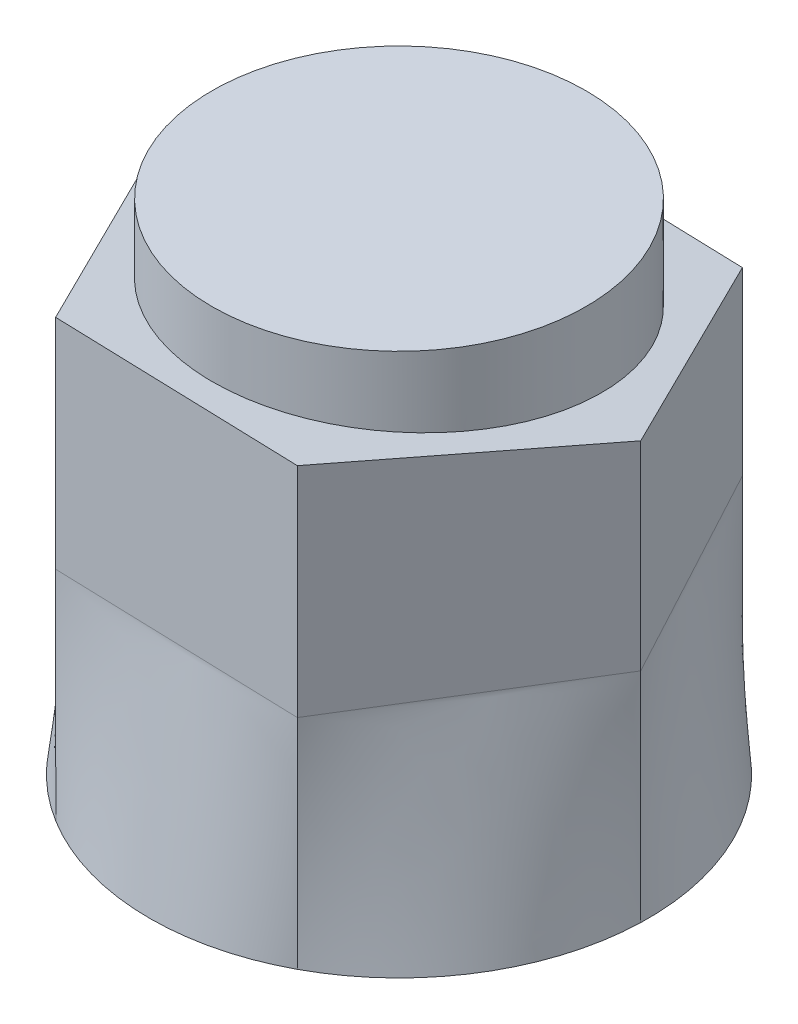
ISO-10303-21;
HEADER;
FILE_DESCRIPTION(('STEP AP214'),'2;1');
FILE_NAME('part.step','',(''),(''),'','','');
FILE_SCHEMA(('AUTOMOTIVE_DESIGN { 1 0 10303 214 1 1 1 1 }'));
ENDSEC;
DATA;
#1=APPLICATION_CONTEXT('core data for automotive mechanical design processes');
#2=APPLICATION_PROTOCOL_DEFINITION('international standard','automotive_design',2000,#1);
#3=PRODUCT_CONTEXT('',#1,'mechanical');
#4=PRODUCT('Part','Part','',(#3));
#5=PRODUCT_RELATED_PRODUCT_CATEGORY('part','',(#4));
#6=PRODUCT_DEFINITION_FORMATION('','',#4);
#7=PRODUCT_DEFINITION_CONTEXT('part definition',#1,'design');
#8=PRODUCT_DEFINITION('design','',#6,#7);
#9=PRODUCT_DEFINITION_SHAPE('','',#8);
#10=(LENGTH_UNIT() NAMED_UNIT(*) SI_UNIT(.MILLI.,.METRE.));
#11=(NAMED_UNIT(*) PLANE_ANGLE_UNIT() SI_UNIT($,.RADIAN.));
#12=(NAMED_UNIT(*) SI_UNIT($,.STERADIAN.) SOLID_ANGLE_UNIT());
#13=UNCERTAINTY_MEASURE_WITH_UNIT(LENGTH_MEASURE(1.E-05),#10,'distance_accuracy_value','');
#14=(GEOMETRIC_REPRESENTATION_CONTEXT(3) GLOBAL_UNCERTAINTY_ASSIGNED_CONTEXT((#13)) GLOBAL_UNIT_ASSIGNED_CONTEXT((#10,
#11,#12)) REPRESENTATION_CONTEXT('',''));
#15=CARTESIAN_POINT('',(0.,0.,0.));
#16=DIRECTION('',(0.,0.,1.));
#17=DIRECTION('',(1.,0.,0.));
#18=AXIS2_PLACEMENT_3D('',#15,#16,#17);
#19=CARTESIAN_POINT('',(0.,0.,0.));
#20=DIRECTION('',(0.,1.,0.));
#21=DIRECTION('',(0.,0.,1.));
#22=AXIS2_PLACEMENT_3D('',#19,#20,#21);
#23=PLANE('',#22);
#24=CARTESIAN_POINT('',(0.,0.,0.));
#25=DIRECTION('',(0.,1.,0.));
#26=DIRECTION('',(0.,0.,1.));
#27=AXIS2_PLACEMENT_3D('',#24,#25,#26);
#28=CIRCLE('',#27,12.7);
#29=CARTESIAN_POINT('',(-6.68296668589842,0.,10.7994424057528));
#30=VERTEX_POINT('',#29);
#31=CARTESIAN_POINT('',(6.01110812713965,0.,11.1873401255095));
#32=VERTEX_POINT('',#31);
#33=EDGE_CURVE('E106',#30,#32,#28,.T.);
#34=ORIENTED_EDGE('',*,*,#33,.F.);
#35=CARTESIAN_POINT('',(-12.6940748130381,0.,-0.387897719756733));
#36=VERTEX_POINT('',#35);
#37=EDGE_CURVE('E266',#36,#30,#28,.T.);
#38=ORIENTED_EDGE('',*,*,#37,.F.);
#39=CARTESIAN_POINT('',(-6.01110812713965,0.,-11.1873401255095));
#40=VERTEX_POINT('',#39);
#41=EDGE_CURVE('E416',#40,#36,#28,.T.);
#42=ORIENTED_EDGE('',*,*,#41,.F.);
#43=CARTESIAN_POINT('',(6.68296668589842,0.,-10.7994424057528));
#44=VERTEX_POINT('',#43);
#45=EDGE_CURVE('E332',#44,#40,#28,.T.);
#46=ORIENTED_EDGE('',*,*,#45,.F.);
#47=CARTESIAN_POINT('',(12.6940748130381,0.,0.387897719756726));
#48=VERTEX_POINT('',#47);
#49=EDGE_CURVE('E467',#48,#44,#28,.T.);
#50=ORIENTED_EDGE('',*,*,#49,.F.);
#51=EDGE_CURVE('E468',#32,#48,#28,.T.);
#52=ORIENTED_EDGE('',*,*,#51,.F.);
#53=EDGE_LOOP('',(#34,#38,#42,#46,#50,#52));
#54=FACE_BOUND('',#53,.T.);
#55=ADVANCED_FACE('F97',(#54),#23,.F.);
#56=CARTESIAN_POINT('',(-12.7,11.1125,-0.388078777970537));
#57=CARTESIAN_POINT('',(-12.6940748130381,0.,-0.387897719756733));
#58=CARTESIAN_POINT('',(-12.1428261599673,11.1125,-1.28845238122696));
#59=CARTESIAN_POINT('',(-12.6617500030583,0.,-1.44573728750991));
#60=CARTESIAN_POINT('',(-11.5856523199347,11.1125,-2.18882598448338));
#61=CARTESIAN_POINT('',(-12.4939905005337,0.,-2.53611988957809));
#62=CARTESIAN_POINT('',(-10.4713046398693,11.1125,-3.98957319099623));
#63=CARTESIAN_POINT('',(-11.8614424711025,0.,-4.67310231286075));
#64=CARTESIAN_POINT('',(-9.91413079983663,11.1125,-4.88994679425265));
#65=CARTESIAN_POINT('',(-11.3963409145963,0.,-5.7183993954558));
#66=CARTESIAN_POINT('',(-8.79978311977128,11.1125,-6.6906940007655));
#67=CARTESIAN_POINT('',(-10.2025438969093,0.,-7.64753397634105));
#68=CARTESIAN_POINT('',(-8.2426092797386,11.1125,-7.59106760402193));
#69=CARTESIAN_POINT('',(-9.47459076760174,0.,-8.5301718920673));
#70=CARTESIAN_POINT('',(-7.12826159967325,11.1125,-9.39181481053478));
#71=CARTESIAN_POINT('',(-7.84435928388421,0.,-10.0497626910827));
#72=CARTESIAN_POINT('',(-6.57108775964057,11.1125,-10.2921884137912));
#73=CARTESIAN_POINT('',(-6.94338647093211,0.,-10.6864144482479));
#74=CARTESIAN_POINT('',(-6.01391391960789,11.1125,-11.1925620170476));
#75=CARTESIAN_POINT('',(-6.01110812713965,0.,-11.1873401255095));
#76=B_SPLINE_SURFACE_WITH_KNOTS('',3,1,((#56,#57),(#58,#59),(#60,#61),(#62,#63),(#64,#65),(#66,
#67),(#68,#69),(#70,#71),(#72,#73),(#74,#75)),.UNSPECIFIED.,.F.,.F.,.F.,(4,2,2,2,4),(2,2),(0.,
0.25,0.5,0.75,1.),(0.,1.),.UNSPECIFIED.);
#77=DIRECTION('',(-0.52621784928334,0.,0.850349795728567));
#78=VECTOR('',#77,1.);
#79=CARTESIAN_POINT('',(-6.01391391960789,11.1125,-11.1925620170476));
#80=LINE('',#79,#78);
#81=CARTESIAN_POINT('',(-6.01391391960789,11.1125,-11.1925620170476));
#82=VERTEX_POINT('',#81);
#83=CARTESIAN_POINT('',(-12.7,11.1125,-0.388078777970539));
#84=VERTEX_POINT('',#83);
#85=EDGE_CURVE('E316',#82,#84,#80,.T.);
#86=DIRECTION('',(0.000252489724996501,-0.999999857716082,0.000469911432631494));
#87=VECTOR('',#86,1.);
#88=CARTESIAN_POINT('',(-6.01251102337377,5.55625,-11.1899510712786));
#89=LINE('',#88,#87);
#90=EDGE_CURVE('E311',#82,#40,#89,.T.);
#91=DIRECTION('',(-0.000533200100685727,0.999999857716082,-1.62932002737735E-05));
#92=VECTOR('',#91,1.);
#93=CARTESIAN_POINT('',(-12.697037406519,5.55625,-0.387988248863635));
#94=LINE('',#93,#92);
#95=EDGE_CURVE('E309',#36,#84,#94,.T.);
#96=ORIENTED_EDGE('',*,*,#85,.F.);
#97=ORIENTED_EDGE('',*,*,#90,.T.);
#98=ORIENTED_EDGE('',*,*,#41,.T.);
#99=ORIENTED_EDGE('',*,*,#95,.T.);
#100=EDGE_LOOP('',(#96,#97,#98,#99));
#101=FACE_BOUND('',#100,.T.);
#102=ADVANCED_FACE('F227',(#101),#76,.T.);
#103=CARTESIAN_POINT('',(-6.01391391960789,11.1125,-11.1925620170476));
#104=CARTESIAN_POINT('',(-6.01110812713965,0.,-11.1873401255095));
#105=CARTESIAN_POINT('',(-4.95558058627455,11.1125,-11.1602221188834));
#106=CARTESIAN_POINT('',(-5.07882978334719,0.,-11.6882658027712));
#107=CARTESIAN_POINT('',(-3.89724725294122,11.1125,-11.1278822207192));
#108=CARTESIAN_POINT('',(-4.05065099884922,0.,-12.0881731128927));
#109=CARTESIAN_POINT('',(-1.78058058627455,11.1125,-11.0632024243908));
#110=CARTESIAN_POINT('',(-1.88369591813004,0.,-12.6088616619328));
#111=CARTESIAN_POINT('',(-0.722247252941219,11.1125,-11.0308625262266));
#112=CARTESIAN_POINT('',(-0.745891311847872,0.,-12.7287204399563));
#113=CARTESIAN_POINT('',(1.39441941372545,11.1125,-10.9661827298982));
#114=CARTESIAN_POINT('',(1.52168675136133,0.,-12.6594291861198));
#115=CARTESIAN_POINT('',(2.45275274705878,11.1125,-10.933842831734));
#116=CARTESIAN_POINT('',(2.65005017337737,0.,-12.4703222412383));
#117=CARTESIAN_POINT('',(4.56941941372544,11.1125,-10.8691630354055));
#118=CARTESIAN_POINT('',(4.7811701505406,0.,-11.8182957617974));
#119=CARTESIAN_POINT('',(5.62775274705878,11.1125,-10.8368231372413));
#120=CARTESIAN_POINT('',(5.78301315208568,0.,-11.3563562962443));
#121=CARTESIAN_POINT('',(6.68608608039211,11.1125,-10.8044832390771));
#122=CARTESIAN_POINT('',(6.68296668589842,0.,-10.7994424057528));
#123=B_SPLINE_SURFACE_WITH_KNOTS('',3,1,((#103,#104),(#105,#106),(#107,#108),(#109,#110),(#111,
#112),(#113,#114),(#115,#116),(#117,#118),(#119,#120),(#121,#122)),.UNSPECIFIED.,.F.,.F.,.F.,(4,
2,2,2,4),(2,2),(0.,0.25,0.5,0.75,1.),(0.,1.),.UNSPECIFIED.);
#124=DIRECTION('',(-0.999533449845517,0.,-0.0305431275398998));
#125=VECTOR('',#124,1.);
#126=CARTESIAN_POINT('',(6.68608608039211,11.1125,-10.8044832390771));
#127=LINE('',#126,#125);
#128=CARTESIAN_POINT('',(6.68608608039211,11.1125,-10.8044832390771));
#129=VERTEX_POINT('',#128);
#130=EDGE_CURVE('E324',#129,#82,#127,.T.);
#131=DIRECTION('',(-0.000280710375689694,-0.999999857716082,0.00045361823235712));
#132=VECTOR('',#131,1.);
#133=CARTESIAN_POINT('',(6.68452638314526,5.55625,-10.801962822415));
#134=LINE('',#133,#132);
#135=EDGE_CURVE('E334',#129,#44,#134,.T.);
#136=ORIENTED_EDGE('',*,*,#130,.F.);
#137=ORIENTED_EDGE('',*,*,#135,.T.);
#138=ORIENTED_EDGE('',*,*,#45,.T.);
#139=ORIENTED_EDGE('',*,*,#90,.F.);
#140=EDGE_LOOP('',(#136,#137,#138,#139));
#141=FACE_BOUND('',#140,.T.);
#142=ADVANCED_FACE('F233',(#141),#123,.T.);
#143=CARTESIAN_POINT('',(-6.68608608039211,11.1125,10.8044832390771));
#144=CARTESIAN_POINT('',(-6.68296668589842,0.,10.7994424057528));
#145=CARTESIAN_POINT('',(-7.18724557369277,11.1125,9.87176973765646));
#146=CARTESIAN_POINT('',(-7.58292021971115,0.,10.2425285152613));
#147=CARTESIAN_POINT('',(-7.68840506699342,11.1125,8.93905623623583));
#148=CARTESIAN_POINT('',(-8.44333950168444,0.,9.55205322331457));
#149=CARTESIAN_POINT('',(-8.69072405359474,11.1125,7.07362923339455));
#150=CARTESIAN_POINT('',(-9.97774655297247,0.,7.93575934907208));
#151=CARTESIAN_POINT('',(-9.1918835468954,11.1125,6.14091573197392));
#152=CARTESIAN_POINT('',(-10.6504496027485,0.,7.01032104450051));
#153=CARTESIAN_POINT('',(-10.1942025334967,11.1125,4.27548872913265));
#154=CARTESIAN_POINT('',(-11.7242306482706,0.,5.01189520977879));
#155=CARTESIAN_POINT('',(-10.6953620267974,11.1125,3.34277522771201));
#156=CARTESIAN_POINT('',(-12.1246409409791,0.,3.94015034917096));
#157=CARTESIAN_POINT('',(-11.6976810133987,11.1125,1.47734822487073));
#158=CARTESIAN_POINT('',(-12.6255294344248,0.,1.76853307071467));
#159=CARTESIAN_POINT('',(-12.1988405066993,11.1125,0.544634723450098));
#160=CARTESIAN_POINT('',(-12.7263996230178,0.,0.669941847996439));
#161=CARTESIAN_POINT('',(-12.7,11.1125,-0.388078777970539));
#162=CARTESIAN_POINT('',(-12.6940748130381,0.,-0.387897719756734));
#163=B_SPLINE_SURFACE_WITH_KNOTS('',3,1,((#143,#144),(#145,#146),(#147,#148),(#149,#150),(#151,
#152),(#153,#154),(#155,#156),(#157,#158),(#159,#160),(#161,#162)),.UNSPECIFIED.,.F.,.F.,.F.,(4,
2,2,2,4),(2,2),(0.,0.25,0.5,0.75,1.),(0.,1.),.UNSPECIFIED.);
#164=DIRECTION('',(0.473315600562177,0.,0.880892923268467));
#165=VECTOR('',#164,1.);
#166=CARTESIAN_POINT('',(-12.7,11.1125,-0.388078777970539));
#167=LINE('',#166,#165);
#168=CARTESIAN_POINT('',(-6.68608608039211,11.1125,10.8044832390771));
#169=VERTEX_POINT('',#168);
#170=EDGE_CURVE('E312',#84,#169,#167,.T.);
#171=DIRECTION('',(0.000280710375689694,-0.999999857716082,-0.000453618232356964));
#172=VECTOR('',#171,1.);
#173=CARTESIAN_POINT('',(-6.68452638314526,5.55625,10.801962822415));
#174=LINE('',#173,#172);
#175=EDGE_CURVE('E193',#169,#30,#174,.T.);
#176=ORIENTED_EDGE('',*,*,#170,.F.);
#177=ORIENTED_EDGE('',*,*,#95,.F.);
#178=ORIENTED_EDGE('',*,*,#37,.T.);
#179=ORIENTED_EDGE('',*,*,#175,.F.);
#180=EDGE_LOOP('',(#176,#177,#178,#179));
#181=FACE_BOUND('',#180,.T.);
#182=ADVANCED_FACE('F272',(#181),#163,.T.);
#183=CARTESIAN_POINT('',(6.68608608039211,11.1125,-10.8044832390771));
#184=CARTESIAN_POINT('',(6.68296668589842,0.,-10.7994424057528));
#185=CARTESIAN_POINT('',(7.18724557369276,11.1125,-9.87176973765647));
#186=CARTESIAN_POINT('',(7.58292021971115,0.,-10.2425285152613));
#187=CARTESIAN_POINT('',(7.68840506699342,11.1125,-8.93905623623583));
#188=CARTESIAN_POINT('',(8.44333950168443,0.,-9.55205322331457));
#189=CARTESIAN_POINT('',(8.69072405359474,11.1125,-7.07362923339456));
#190=CARTESIAN_POINT('',(9.97774655297247,0.,-7.93575934907208));
#191=CARTESIAN_POINT('',(9.1918835468954,11.1125,-6.14091573197392));
#192=CARTESIAN_POINT('',(10.6504496027485,0.,-7.01032104450052));
#193=CARTESIAN_POINT('',(10.1942025334967,11.1125,-4.27548872913265));
#194=CARTESIAN_POINT('',(11.7242306482706,0.,-5.0118952097788));
#195=CARTESIAN_POINT('',(10.6953620267974,11.1125,-3.34277522771201));
#196=CARTESIAN_POINT('',(12.1246409409791,0.,-3.94015034917097));
#197=CARTESIAN_POINT('',(11.6976810133987,11.1125,-1.47734822487074));
#198=CARTESIAN_POINT('',(12.6255294344248,0.,-1.76853307071467));
#199=CARTESIAN_POINT('',(12.1988405066993,11.1125,-0.544634723450099));
#200=CARTESIAN_POINT('',(12.7263996230178,0.,-0.669941847996447));
#201=CARTESIAN_POINT('',(12.7,11.1125,0.388078777970538));
#202=CARTESIAN_POINT('',(12.6940748130381,0.,0.387897719756726));
#203=B_SPLINE_SURFACE_WITH_KNOTS('',3,1,((#183,#184),(#185,#186),(#187,#188),(#189,#190),(#191,
#192),(#193,#194),(#195,#196),(#197,#198),(#199,#200),(#201,#202)),.UNSPECIFIED.,.F.,.F.,.F.,(4,
2,2,2,4),(2,2),(0.,0.25,0.5,0.75,1.),(0.,1.),.UNSPECIFIED.);
#204=DIRECTION('',(-0.473315600562178,0.,-0.880892923268467));
#205=VECTOR('',#204,1.);
#206=CARTESIAN_POINT('',(12.7,11.1125,0.388078777970538));
#207=LINE('',#206,#205);
#208=CARTESIAN_POINT('',(12.7,11.1125,0.388078777970538));
#209=VERTEX_POINT('',#208);
#210=EDGE_CURVE('E179',#209,#129,#207,.T.);
#211=DIRECTION('',(-0.000533200100685727,-0.999999857716082,-1.62932002744857E-05));
#212=VECTOR('',#211,1.);
#213=CARTESIAN_POINT('',(12.697037406519,5.55625,0.387988248863632));
#214=LINE('',#213,#212);
#215=EDGE_CURVE('E176',#209,#48,#214,.T.);
#216=ORIENTED_EDGE('',*,*,#210,.F.);
#217=ORIENTED_EDGE('',*,*,#215,.T.);
#218=ORIENTED_EDGE('',*,*,#49,.T.);
#219=ORIENTED_EDGE('',*,*,#135,.F.);
#220=EDGE_LOOP('',(#216,#217,#218,#219));
#221=FACE_BOUND('',#220,.T.);
#222=ADVANCED_FACE('F283',(#221),#203,.T.);
#223=CARTESIAN_POINT('',(12.7,11.1125,0.388078777970537));
#224=CARTESIAN_POINT('',(12.6940748130381,0.,0.387897719756726));
#225=CARTESIAN_POINT('',(12.1428261599673,11.1125,1.28845238122696));
#226=CARTESIAN_POINT('',(12.6617500030583,0.,1.4457372875099));
#227=CARTESIAN_POINT('',(11.5856523199346,11.1125,2.18882598448339));
#228=CARTESIAN_POINT('',(12.4939905005337,0.,2.53611988957808));
#229=CARTESIAN_POINT('',(10.4713046398693,11.1125,3.98957319099624));
#230=CARTESIAN_POINT('',(11.8614424711025,0.,4.67310231286074));
#231=CARTESIAN_POINT('',(9.91413079983662,11.1125,4.88994679425266));
#232=CARTESIAN_POINT('',(11.3963409145963,0.,5.71839939545579));
#233=CARTESIAN_POINT('',(8.79978311977127,11.1125,6.69069400076551));
#234=CARTESIAN_POINT('',(10.2025438969093,0.,7.64753397634105));
#235=CARTESIAN_POINT('',(8.24260927973859,11.1125,7.59106760402194));
#236=CARTESIAN_POINT('',(9.47459076760174,0.,8.53017189206729));
#237=CARTESIAN_POINT('',(7.12826159967324,11.1125,9.39181481053479));
#238=CARTESIAN_POINT('',(7.84435928388422,0.,10.0497626910827));
#239=CARTESIAN_POINT('',(6.57108775964057,11.1125,10.2921884137912));
#240=CARTESIAN_POINT('',(6.94338647093211,0.,10.6864144482479));
#241=CARTESIAN_POINT('',(6.01391391960789,11.1125,11.1925620170476));
#242=CARTESIAN_POINT('',(6.01110812713965,0.,11.1873401255095));
#243=B_SPLINE_SURFACE_WITH_KNOTS('',3,1,((#223,#224),(#225,#226),(#227,#228),(#229,#230),(#231,
#232),(#233,#234),(#235,#236),(#237,#238),(#239,#240),(#241,#242)),.UNSPECIFIED.,.F.,.F.,.F.,(4,
2,2,2,4),(2,2),(0.,0.25,0.5,0.75,1.),(0.,1.),.UNSPECIFIED.);
#244=DIRECTION('',(0.52621784928334,0.,-0.850349795728568));
#245=VECTOR('',#244,1.);
#246=CARTESIAN_POINT('',(6.01391391960789,11.1125,11.1925620170476));
#247=LINE('',#246,#245);
#248=CARTESIAN_POINT('',(6.01391391960789,11.1125,11.1925620170476));
#249=VERTEX_POINT('',#248);
#250=EDGE_CURVE('E172',#249,#209,#247,.T.);
#251=DIRECTION('',(-0.000252489724996345,-0.999999857716082,-0.000469911432631806));
#252=VECTOR('',#251,1.);
#253=CARTESIAN_POINT('',(6.01251102337377,5.55625,11.1899510712786));
#254=LINE('',#253,#252);
#255=EDGE_CURVE('E114',#249,#32,#254,.T.);
#256=ORIENTED_EDGE('',*,*,#250,.F.);
#257=ORIENTED_EDGE('',*,*,#255,.T.);
#258=ORIENTED_EDGE('',*,*,#51,.T.);
#259=ORIENTED_EDGE('',*,*,#215,.F.);
#260=EDGE_LOOP('',(#256,#257,#258,#259));
#261=FACE_BOUND('',#260,.T.);
#262=ADVANCED_FACE('F174',(#261),#243,.T.);
#263=CARTESIAN_POINT('',(6.01391391960789,11.1125,11.1925620170476));
#264=CARTESIAN_POINT('',(6.01110812713965,0.,11.1873401255095));
#265=CARTESIAN_POINT('',(4.95558058627456,11.1125,11.1602221188834));
#266=CARTESIAN_POINT('',(5.07882978334719,0.,11.6882658027712));
#267=CARTESIAN_POINT('',(3.89724725294123,11.1125,11.1278822207192));
#268=CARTESIAN_POINT('',(4.05065099884923,0.,12.0881731128926));
#269=CARTESIAN_POINT('',(1.78058058627456,11.1125,11.0632024243908));
#270=CARTESIAN_POINT('',(1.88369591813004,0.,12.6088616619328));
#271=CARTESIAN_POINT('',(0.722247252941228,11.1125,11.0308625262266));
#272=CARTESIAN_POINT('',(0.745891311847876,0.,12.7287204399563));
#273=CARTESIAN_POINT('',(-1.39441941372544,11.1125,10.9661827298982));
#274=CARTESIAN_POINT('',(-1.52168675136133,0.,12.6594291861198));
#275=CARTESIAN_POINT('',(-2.45275274705877,11.1125,10.9338428317339));
#276=CARTESIAN_POINT('',(-2.65005017337737,0.,12.4703222412383));
#277=CARTESIAN_POINT('',(-4.56941941372544,11.1125,10.8691630354055));
#278=CARTESIAN_POINT('',(-4.7811701505406,0.,11.8182957617974));
#279=CARTESIAN_POINT('',(-5.62775274705877,11.1125,10.8368231372413));
#280=CARTESIAN_POINT('',(-5.78301315208568,0.,11.3563562962443));
#281=CARTESIAN_POINT('',(-6.68608608039211,11.1125,10.8044832390771));
#282=CARTESIAN_POINT('',(-6.68296668589842,0.,10.7994424057528));
#283=B_SPLINE_SURFACE_WITH_KNOTS('',3,1,((#263,#264),(#265,#266),(#267,#268),(#269,#270),(#271,
#272),(#273,#274),(#275,#276),(#277,#278),(#279,#280),(#281,#282)),.UNSPECIFIED.,.F.,.F.,.F.,(4,
2,2,2,4),(2,2),(0.,0.25,0.5,0.75,1.),(0.,1.),.UNSPECIFIED.);
#284=DIRECTION('',(0.999533449845517,0.,0.0305431275398999));
#285=VECTOR('',#284,1.);
#286=CARTESIAN_POINT('',(-6.68608608039211,11.1125,10.8044832390771));
#287=LINE('',#286,#285);
#288=EDGE_CURVE('E180',#169,#249,#287,.T.);
#289=ORIENTED_EDGE('',*,*,#288,.F.);
#290=ORIENTED_EDGE('',*,*,#175,.T.);
#291=ORIENTED_EDGE('',*,*,#33,.T.);
#292=ORIENTED_EDGE('',*,*,#255,.F.);
#293=EDGE_LOOP('',(#289,#290,#291,#292));
#294=FACE_BOUND('',#293,.T.);
#295=ADVANCED_FACE('F186',(#294),#283,.T.);
#296=CARTESIAN_POINT('',(-6.68608608039211,22.225,10.8044832390771));
#297=DIRECTION('',(0.0305431275398999,0.,-0.999533449845517));
#298=DIRECTION('',(-0.999533449845518,0.,-0.0305431275398999));
#299=AXIS2_PLACEMENT_3D('',#296,#297,#298);
#300=PLANE('',#299);
#301=ORIENTED_EDGE('',*,*,#288,.T.);
#302=DIRECTION('',(0.,-1.,0.));
#303=VECTOR('',#302,1.);
#304=CARTESIAN_POINT('',(6.01391391960789,22.225,11.1925620170476));
#305=LINE('',#304,#303);
#306=CARTESIAN_POINT('',(6.01391391960789,22.225,11.1925620170476));
#307=VERTEX_POINT('',#306);
#308=EDGE_CURVE('E196',#307,#249,#305,.T.);
#309=ORIENTED_EDGE('',*,*,#308,.F.);
#310=DIRECTION('',(0.999533449845517,0.,0.0305431275398999));
#311=VECTOR('',#310,1.);
#312=CARTESIAN_POINT('',(-6.68608608039211,22.225,10.8044832390771));
#313=LINE('',#312,#311);
#314=CARTESIAN_POINT('',(-6.68608608039211,22.225,10.8044832390771));
#315=VERTEX_POINT('',#314);
#316=EDGE_CURVE('E670',#315,#307,#313,.T.);
#317=ORIENTED_EDGE('',*,*,#316,.F.);
#318=DIRECTION('',(0.,-1.,0.));
#319=VECTOR('',#318,1.);
#320=CARTESIAN_POINT('',(-6.68608608039211,22.225,10.8044832390771));
#321=LINE('',#320,#319);
#322=EDGE_CURVE('E206',#315,#169,#321,.T.);
#323=ORIENTED_EDGE('',*,*,#322,.T.);
#324=EDGE_LOOP('',(#301,#309,#317,#323));
#325=FACE_BOUND('',#324,.T.);
#326=ADVANCED_FACE('F204',(#325),#300,.F.);
#327=CARTESIAN_POINT('',(6.01391391960789,22.225,11.1925620170476));
#328=DIRECTION('',(-0.850349795728567,0.,-0.52621784928334));
#329=DIRECTION('',(-0.52621784928334,0.,0.850349795728568));
#330=AXIS2_PLACEMENT_3D('',#327,#328,#329);
#331=PLANE('',#330);
#332=ORIENTED_EDGE('',*,*,#250,.T.);
#333=DIRECTION('',(0.,-1.,0.));
#334=VECTOR('',#333,1.);
#335=CARTESIAN_POINT('',(12.7,22.225,0.388078777970538));
#336=LINE('',#335,#334);
#337=CARTESIAN_POINT('',(12.7,21.2623048089211,0.388078777970538));
#338=VERTEX_POINT('',#337);
#339=EDGE_CURVE('E200',#338,#209,#336,.T.);
#340=ORIENTED_EDGE('',*,*,#339,.F.);
#341=DIRECTION('',(0.524713892198339,-0.0755508581011277,-0.847919453234948));
#342=VECTOR('',#341,1.);
#343=CARTESIAN_POINT('',(6.01391391960789,22.225,11.1925620170476));
#344=LINE('',#343,#342);
#345=EDGE_CURVE('E137',#307,#338,#344,.T.);
#346=ORIENTED_EDGE('',*,*,#345,.F.);
#347=ORIENTED_EDGE('',*,*,#308,.T.);
#348=EDGE_LOOP('',(#332,#340,#346,#347));
#349=FACE_BOUND('',#348,.T.);
#350=ADVANCED_FACE('F197',(#349),#331,.F.);
#351=CARTESIAN_POINT('',(12.7,22.225,0.388078777970538));
#352=DIRECTION('',(-0.880892923268467,0.,0.473315600562177));
#353=DIRECTION('',(0.473315600562178,0.,0.880892923268467));
#354=AXIS2_PLACEMENT_3D('',#351,#352,#353);
#355=PLANE('',#354);
#356=ORIENTED_EDGE('',*,*,#210,.T.);
#357=DIRECTION('',(0.,-1.,0.));
#358=VECTOR('',#357,1.);
#359=CARTESIAN_POINT('',(6.68608608039211,22.225,-10.8044832390771));
#360=LINE('',#359,#358);
#361=CARTESIAN_POINT('',(6.68608608039211,20.2996096178422,-10.8044832390771));
#362=VERTEX_POINT('',#361);
#363=EDGE_CURVE('E343',#362,#129,#360,.T.);
#364=ORIENTED_EDGE('',*,*,#363,.F.);
#365=DIRECTION('',(-0.471962840765306,-0.0755508581011277,-0.878375286979845));
#366=VECTOR('',#365,1.);
#367=CARTESIAN_POINT('',(12.7343270126681,21.2677998077624,0.451965162658387));
#368=LINE('',#367,#366);
#369=EDGE_CURVE('E132',#338,#362,#368,.T.);
#370=ORIENTED_EDGE('',*,*,#369,.F.);
#371=ORIENTED_EDGE('',*,*,#339,.T.);
#372=EDGE_LOOP('',(#356,#364,#370,#371));
#373=FACE_BOUND('',#372,.T.);
#374=ADVANCED_FACE('F380',(#373),#355,.F.);
#375=CARTESIAN_POINT('',(6.68608608039211,22.225,-10.8044832390771));
#376=DIRECTION('',(-0.0305431275398998,0.,0.999533449845517));
#377=DIRECTION('',(0.999533449845518,0.,0.0305431275398998));
#378=AXIS2_PLACEMENT_3D('',#375,#376,#377);
#379=PLANE('',#378);
#380=ORIENTED_EDGE('',*,*,#130,.T.);
#381=DIRECTION('',(0.,-1.,0.));
#382=VECTOR('',#381,1.);
#383=CARTESIAN_POINT('',(-6.01391391960789,22.225,-11.1925620170476));
#384=LINE('',#383,#382);
#385=CARTESIAN_POINT('',(-6.01391391960789,20.2996096178422,-11.1925620170476));
#386=VERTEX_POINT('',#385);
#387=EDGE_CURVE('E341',#386,#82,#384,.T.);
#388=ORIENTED_EDGE('',*,*,#387,.F.);
#389=DIRECTION('',(-0.999533449845517,0.,-0.0305431275398998));
#390=VECTOR('',#389,1.);
#391=CARTESIAN_POINT('',(6.68608608039211,20.2996096178422,-10.8044832390771));
#392=LINE('',#391,#390);
#393=EDGE_CURVE('E672',#362,#386,#392,.T.);
#394=ORIENTED_EDGE('',*,*,#393,.F.);
#395=ORIENTED_EDGE('',*,*,#363,.T.);
#396=EDGE_LOOP('',(#380,#388,#394,#395));
#397=FACE_BOUND('',#396,.T.);
#398=ADVANCED_FACE('F339',(#397),#379,.F.);
#399=CARTESIAN_POINT('',(-6.01391391960789,22.225,-11.1925620170476));
#400=DIRECTION('',(0.850349795728567,0.,0.52621784928334));
#401=DIRECTION('',(0.52621784928334,0.,-0.850349795728567));
#402=AXIS2_PLACEMENT_3D('',#399,#400,#401);
#403=PLANE('',#402);
#404=ORIENTED_EDGE('',*,*,#85,.T.);
#405=DIRECTION('',(0.,-1.,0.));
#406=VECTOR('',#405,1.);
#407=CARTESIAN_POINT('',(-12.7,22.225,-0.388078777970539));
#408=LINE('',#407,#406);
#409=CARTESIAN_POINT('',(-12.7,21.2623048089211,-0.388078777970539));
#410=VERTEX_POINT('',#409);
#411=EDGE_CURVE('E349',#410,#84,#408,.T.);
#412=ORIENTED_EDGE('',*,*,#411,.F.);
#413=DIRECTION('',(-0.52471389219834,0.0755508581011277,0.847919453234948));
#414=VECTOR('',#413,1.);
#415=CARTESIAN_POINT('',(-6.09024137113104,20.3105996155247,-11.0692195023466));
#416=LINE('',#415,#414);
#417=EDGE_CURVE('E348',#386,#410,#416,.T.);
#418=ORIENTED_EDGE('',*,*,#417,.F.);
#419=ORIENTED_EDGE('',*,*,#387,.T.);
#420=EDGE_LOOP('',(#404,#412,#418,#419));
#421=FACE_BOUND('',#420,.T.);
#422=ADVANCED_FACE('F347',(#421),#403,.F.);
#423=CARTESIAN_POINT('',(-12.7,22.225,-0.388078777970539));
#424=DIRECTION('',(0.880892923268467,0.,-0.473315600562177));
#425=DIRECTION('',(-0.473315600562178,0.,-0.880892923268467));
#426=AXIS2_PLACEMENT_3D('',#423,#424,#425);
#427=PLANE('',#426);
#428=ORIENTED_EDGE('',*,*,#170,.T.);
#429=ORIENTED_EDGE('',*,*,#322,.F.);
#430=DIRECTION('',(0.471962840765306,0.0755508581011277,0.878375286979845));
#431=VECTOR('',#430,1.);
#432=CARTESIAN_POINT('',(-12.6656729873319,21.2677998077624,-0.324192393282689));
#433=LINE('',#432,#431);
#434=EDGE_CURVE('E676',#410,#315,#433,.T.);
#435=ORIENTED_EDGE('',*,*,#434,.F.);
#436=ORIENTED_EDGE('',*,*,#411,.T.);
#437=EDGE_LOOP('',(#428,#429,#435,#436));
#438=FACE_BOUND('',#437,.T.);
#439=ADVANCED_FACE('F393',(#438),#427,.F.);
#440=CARTESIAN_POINT('',(-6.68608608039211,22.225,10.8044832390771));
#441=DIRECTION('',(0.00266200896657633,0.996194698091746,-0.0871150802224119));
#442=DIRECTION('',(0.,0.087115388885489,0.996198227773634));
#443=AXIS2_PLACEMENT_3D('',#440,#441,#442);
#444=PLANE('',#443);
#445=CARTESIAN_POINT('',(0.,21.2623048089211,0.));
#446=DIRECTION('',(0.00266200896657633,0.996194698091746,-0.0871150802224119));
#447=DIRECTION('',(-0.0304269017183883,0.0871557427476549,0.995729923301456));
#448=AXIS2_PLACEMENT_3D('',#445,#446,#447);
#449=ELLIPSE('',#448,9.56138395260038,9.525);
#450=CARTESIAN_POINT('',(-0.290923289817547,22.0956343290055,9.52055610977855));
#451=VERTEX_POINT('',#450);
#452=EDGE_CURVE('E14',#451,#451,#449,.T.);
#453=ORIENTED_EDGE('',*,*,#452,.F.);
#454=EDGE_LOOP('',(#453));
#455=FACE_BOUND('',#454,.T.);
#456=ORIENTED_EDGE('',*,*,#316,.T.);
#457=ORIENTED_EDGE('',*,*,#345,.T.);
#458=ORIENTED_EDGE('',*,*,#369,.T.);
#459=ORIENTED_EDGE('',*,*,#393,.T.);
#460=ORIENTED_EDGE('',*,*,#417,.T.);
#461=ORIENTED_EDGE('',*,*,#434,.T.);
#462=EDGE_LOOP('',(#456,#457,#458,#459,#460,#461));
#463=FACE_BOUND('',#462,.T.);
#464=ADVANCED_FACE('F99',(#455,#463),#444,.T.);
#465=CARTESIAN_POINT('',(0.,19.05,0.));
#466=DIRECTION('',(0.,1.,0.));
#467=DIRECTION('',(0.,0.,1.));
#468=AXIS2_PLACEMENT_3D('',#465,#466,#467);
#469=CYLINDRICAL_SURFACE('',#468,9.525);
#470=ORIENTED_EDGE('',*,*,#452,.T.);
#471=EDGE_LOOP('',(#470));
#472=FACE_BOUND('',#471,.T.);
#473=CARTESIAN_POINT('',(0.,25.4,0.));
#474=DIRECTION('',(0.,1.,0.));
#475=DIRECTION('',(0.,0.,1.));
#476=AXIS2_PLACEMENT_3D('',#473,#474,#475);
#477=CIRCLE('',#476,9.525);
#478=CARTESIAN_POINT('',(0.,25.4,9.525));
#479=VERTEX_POINT('',#478);
#480=EDGE_CURVE('E668',#479,#479,#477,.T.);
#481=ORIENTED_EDGE('',*,*,#480,.F.);
#482=EDGE_LOOP('',(#481));
#483=FACE_BOUND('',#482,.T.);
#484=ADVANCED_FACE('F398',(#472,#483),#469,.T.);
#485=CARTESIAN_POINT('',(0.,25.4,0.));
#486=DIRECTION('',(0.,1.,0.));
#487=DIRECTION('',(0.,0.,1.));
#488=AXIS2_PLACEMENT_3D('',#485,#486,#487);
#489=PLANE('',#488);
#490=ORIENTED_EDGE('',*,*,#480,.T.);
#491=EDGE_LOOP('',(#490));
#492=FACE_BOUND('',#491,.T.);
#493=ADVANCED_FACE('F609',(#492),#489,.T.);
#494=CLOSED_SHELL('',(#55,#102,#142,#182,#222,#262,#295,#326,#350,#374,#398,#422,#439,#464,#484,#493));
#495=MANIFOLD_SOLID_BREP('B2',#494);
#496=ADVANCED_BREP_SHAPE_REPRESENTATION('',(#18,#495),#14);
#497=SHAPE_DEFINITION_REPRESENTATION(#9,#496);
ENDSEC;
END-ISO-10303-21;
